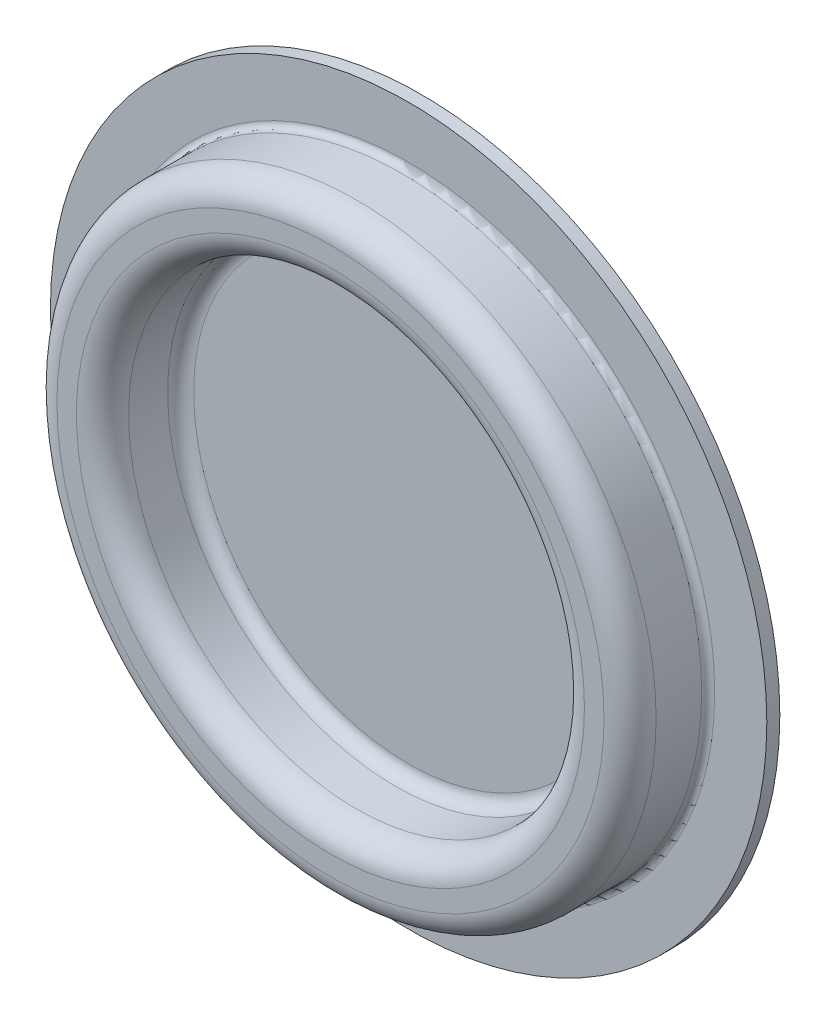
ISO-10303-21;
HEADER;
FILE_DESCRIPTION(('STEP AP214'),'2;1');
FILE_NAME('part.step','',(''),(''),'','','');
FILE_SCHEMA(('AUTOMOTIVE_DESIGN { 1 0 10303 214 1 1 1 1 }'));
ENDSEC;
DATA;
#1=APPLICATION_CONTEXT('core data for automotive mechanical design processes');
#2=APPLICATION_PROTOCOL_DEFINITION('international standard','automotive_design',2000,#1);
#3=PRODUCT_CONTEXT('',#1,'mechanical');
#4=PRODUCT('Part','Part','',(#3));
#5=PRODUCT_RELATED_PRODUCT_CATEGORY('part','',(#4));
#6=PRODUCT_DEFINITION_FORMATION('','',#4);
#7=PRODUCT_DEFINITION_CONTEXT('part definition',#1,'design');
#8=PRODUCT_DEFINITION('design','',#6,#7);
#9=PRODUCT_DEFINITION_SHAPE('','',#8);
#10=(LENGTH_UNIT() NAMED_UNIT(*) SI_UNIT(.MILLI.,.METRE.));
#11=(NAMED_UNIT(*) PLANE_ANGLE_UNIT() SI_UNIT($,.RADIAN.));
#12=(NAMED_UNIT(*) SI_UNIT($,.STERADIAN.) SOLID_ANGLE_UNIT());
#13=UNCERTAINTY_MEASURE_WITH_UNIT(LENGTH_MEASURE(1.E-05),#10,'distance_accuracy_value','');
#14=(GEOMETRIC_REPRESENTATION_CONTEXT(3) GLOBAL_UNCERTAINTY_ASSIGNED_CONTEXT((#13)) GLOBAL_UNIT_ASSIGNED_CONTEXT((#10,
#11,#12)) REPRESENTATION_CONTEXT('',''));
#15=CARTESIAN_POINT('',(0.,0.,0.));
#16=DIRECTION('',(0.,0.,1.));
#17=DIRECTION('',(1.,0.,0.));
#18=AXIS2_PLACEMENT_3D('',#15,#16,#17);
#19=CARTESIAN_POINT('',(0.,0.,74.4769920566213));
#20=DIRECTION('',(0.,0.,1.));
#21=DIRECTION('',(1.,0.,0.));
#22=AXIS2_PLACEMENT_3D('',#19,#20,#21);
#23=CYLINDRICAL_SURFACE('',#22,27.5);
#24=CARTESIAN_POINT('',(-1.11022302462516E-13,0.,0.999999999999779));
#25=DIRECTION('',(0.,0.,1.));
#26=DIRECTION('',(1.,0.,0.));
#27=AXIS2_PLACEMENT_3D('',#24,#25,#26);
#28=CIRCLE('',#27,27.5);
#29=CARTESIAN_POINT('',(27.5,0.,0.999999999999779));
#30=VERTEX_POINT('',#29);
#31=EDGE_CURVE('E12',#30,#30,#28,.T.);
#32=CARTESIAN_POINT('',(0.,0.,0.));
#33=DIRECTION('',(0.,0.,1.));
#34=DIRECTION('',(1.,0.,0.));
#35=AXIS2_PLACEMENT_3D('',#32,#33,#34);
#36=CIRCLE('',#35,27.5);
#37=CARTESIAN_POINT('',(27.5,0.,0.));
#38=VERTEX_POINT('',#37);
#39=EDGE_CURVE('E105',#38,#38,#36,.T.);
#40=CARTESIAN_POINT('',(27.5,0.,0.999999999999779));
#41=CARTESIAN_POINT('',(27.5,0.,0.989583333333113));
#42=CARTESIAN_POINT('',(27.5,0.,0.979166666666448));
#43=CARTESIAN_POINT('',(27.5,0.,0.958333333333117));
#44=CARTESIAN_POINT('',(27.5,0.,0.947916666666451));
#45=CARTESIAN_POINT('',(27.5,0.,0.927083333333125));
#46=CARTESIAN_POINT('',(27.5,0.,0.916666666666464));
#47=CARTESIAN_POINT('',(27.5,0.,0.895833333333138));
#48=CARTESIAN_POINT('',(27.5,0.,0.885416666666472));
#49=CARTESIAN_POINT('',(27.5,0.,0.864583333333141));
#50=CARTESIAN_POINT('',(27.5,0.,0.854166666666475));
#51=CARTESIAN_POINT('',(27.5,0.,0.833333333333149));
#52=CARTESIAN_POINT('',(27.5,0.,0.822916666666488));
#53=CARTESIAN_POINT('',(27.5,0.,0.802083333333162));
#54=CARTESIAN_POINT('',(27.5,0.,0.791666666666496));
#55=CARTESIAN_POINT('',(27.5,0.,0.770833333333165));
#56=CARTESIAN_POINT('',(27.5,0.,0.7604166666665));
#57=CARTESIAN_POINT('',(27.5,0.,0.739583333333169));
#58=CARTESIAN_POINT('',(27.5,0.,0.729166666666503));
#59=CARTESIAN_POINT('',(27.5,0.,0.708333333333172));
#60=CARTESIAN_POINT('',(27.5,0.,0.697916666666507));
#61=CARTESIAN_POINT('',(27.5,0.,0.67708333333318));
#62=CARTESIAN_POINT('',(27.5,0.,0.666666666666519));
#63=CARTESIAN_POINT('',(27.5,0.,0.645833333333193));
#64=CARTESIAN_POINT('',(27.5,0.,0.635416666666527));
#65=CARTESIAN_POINT('',(27.5,0.,0.614583333333196));
#66=CARTESIAN_POINT('',(27.5,0.,0.604166666666531));
#67=CARTESIAN_POINT('',(27.5,0.,0.583333333333204));
#68=CARTESIAN_POINT('',(27.5,0.,0.572916666666543));
#69=CARTESIAN_POINT('',(27.5,0.,0.552083333333217));
#70=CARTESIAN_POINT('',(27.5,0.,0.541666666666551));
#71=CARTESIAN_POINT('',(27.5,0.,0.52083333333322));
#72=CARTESIAN_POINT('',(27.5,0.,0.510416666666555));
#73=CARTESIAN_POINT('',(27.5,0.,0.489583333333224));
#74=CARTESIAN_POINT('',(27.5,0.,0.479166666666558));
#75=CARTESIAN_POINT('',(27.5,0.,0.458333333333227));
#76=CARTESIAN_POINT('',(27.5,0.,0.447916666666562));
#77=CARTESIAN_POINT('',(27.5,0.,0.427083333333235));
#78=CARTESIAN_POINT('',(27.5,0.,0.416666666666575));
#79=CARTESIAN_POINT('',(27.5,0.,0.395833333333248));
#80=CARTESIAN_POINT('',(27.5,0.,0.385416666666583));
#81=CARTESIAN_POINT('',(27.5,0.,0.364583333333252));
#82=CARTESIAN_POINT('',(27.5,0.,0.354166666666586));
#83=CARTESIAN_POINT('',(27.5,0.,0.33333333333326));
#84=CARTESIAN_POINT('',(27.5,0.,0.322916666666599));
#85=CARTESIAN_POINT('',(27.5,0.,0.302083333333272));
#86=CARTESIAN_POINT('',(27.5,0.,0.291666666666607));
#87=CARTESIAN_POINT('',(27.5,0.,0.270833333333276));
#88=CARTESIAN_POINT('',(27.5,0.,0.26041666666661));
#89=CARTESIAN_POINT('',(27.5,0.,0.239583333333279));
#90=CARTESIAN_POINT('',(27.5,0.,0.229166666666614));
#91=CARTESIAN_POINT('',(27.5,0.,0.208333333333283));
#92=CARTESIAN_POINT('',(27.5,0.,0.197916666666617));
#93=CARTESIAN_POINT('',(27.5,0.,0.177083333333291));
#94=CARTESIAN_POINT('',(27.5,0.,0.16666666666663));
#95=CARTESIAN_POINT('',(27.5,0.,0.145833333333303));
#96=CARTESIAN_POINT('',(27.5,0.,0.135416666666638));
#97=CARTESIAN_POINT('',(27.5,0.,0.114583333333307));
#98=CARTESIAN_POINT('',(27.5,0.,0.104166666666641));
#99=CARTESIAN_POINT('',(27.5,0.,0.0833333333333149));
#100=CARTESIAN_POINT('',(27.5,0.,0.072916666666654));
#101=CARTESIAN_POINT('',(27.5,0.,0.0520833333333276));
#102=CARTESIAN_POINT('',(27.5,0.,0.0416666666666621));
#103=CARTESIAN_POINT('',(27.5,0.,0.020833333333331));
#104=CARTESIAN_POINT('',(27.5,0.,0.0104166666666655));
#105=CARTESIAN_POINT('',(27.5,0.,0.));
#106=B_SPLINE_CURVE_WITH_KNOTS('',3,(#40,#41,#42,#43,#44,#45,#46,#47,#48,#49,#50,#51,#52,#53,
#54,#55,#56,#57,#58,#59,#60,#61,#62,#63,#64,#65,#66,#67,#68,#69,#70,#71,#72,#73,#74,#75,#76,#77,
#78,#79,#80,#81,#82,#83,#84,#85,#86,#87,#88,#89,#90,#91,#92,#93,#94,#95,#96,#97,#98,#99,#100,
#101,#102,#103,#104,#105),.UNSPECIFIED.,.F.,.F.,(4,2,2,2,2,2,2,2,2,2,2,2,2,2,2,2,2,2,2,2,2,2,2,
2,2,2,2,2,2,2,2,2,4),(0.,0.0312499999999966,0.0624999999999931,0.0937499999999758,
0.124999999999972,0.156249999999969,0.187499999999952,0.218749999999948,0.249999999999945,
0.281249999999941,0.312499999999938,0.343749999999921,0.374999999999917,0.406249999999914,
0.437499999999896,0.468749999999893,0.499999999999889,0.531249999999886,0.562499999999883,
0.593749999999865,0.624999999999862,0.656249999999858,0.687499999999841,0.718749999999838,
0.749999999999834,0.781249999999831,0.812499999999827,0.84374999999981,0.874999999999806,
0.906249999999803,0.937499999999786,0.968749999999782,0.999999999999779),.UNSPECIFIED.);
#107=EDGE_CURVE('BSEAM47',#30,#38,#106,.T.);
#108=ORIENTED_EDGE('',*,*,#31,.F.);
#109=ORIENTED_EDGE('',*,*,#39,.T.);
#110=ORIENTED_EDGE('',*,*,#107,.T.);
#111=ORIENTED_EDGE('',*,*,#107,.F.);
#112=EDGE_LOOP('',(#108,#110,#109,#111));
#113=FACE_BOUND('',#112,.T.);
#114=ADVANCED_FACE('F47',(#113),#23,.T.);
#115=CARTESIAN_POINT('',(1.11022302462516E-13,27.4999999999997,0.999999999999834));
#116=DIRECTION('',(0.,0.,-1.));
#117=DIRECTION('',(-1.,0.,0.));
#118=AXIS2_PLACEMENT_3D('',#115,#116,#117);
#119=PLANE('',#118);
#120=CARTESIAN_POINT('',(-1.11022302462516E-13,0.,0.999999999999779));
#121=DIRECTION('',(0.,0.,1.));
#122=DIRECTION('',(1.,0.,0.));
#123=AXIS2_PLACEMENT_3D('',#120,#121,#122);
#124=CIRCLE('',#123,23.5);
#125=CARTESIAN_POINT('',(23.4999999999999,0.,0.99999999999978));
#126=VERTEX_POINT('',#125);
#127=EDGE_CURVE('E53',#126,#126,#124,.T.);
#128=ORIENTED_EDGE('',*,*,#127,.F.);
#129=EDGE_LOOP('',(#128));
#130=FACE_BOUND('',#129,.T.);
#131=ORIENTED_EDGE('',*,*,#31,.T.);
#132=EDGE_LOOP('',(#131));
#133=FACE_BOUND('',#132,.T.);
#134=ADVANCED_FACE('F169',(#130,#133),#119,.F.);
#135=CARTESIAN_POINT('',(0.,-2.22044604925031E-13,1.49999999999978));
#136=DIRECTION('',(0.,0.,1.));
#137=DIRECTION('',(1.,0.,0.));
#138=AXIS2_PLACEMENT_3D('',#135,#136,#137);
#139=TOROIDAL_SURFACE('',#138,23.5,0.5);
#140=CARTESIAN_POINT('',(0.,-2.22044604925031E-13,1.49999999999978));
#141=DIRECTION('',(0.,0.,1.));
#142=DIRECTION('',(1.,0.,0.));
#143=AXIS2_PLACEMENT_3D('',#140,#141,#142);
#144=CIRCLE('',#143,23.);
#145=CARTESIAN_POINT('',(23.,0.,1.49999999999978));
#146=VERTEX_POINT('',#145);
#147=EDGE_CURVE('E57',#146,#146,#144,.T.);
#148=ORIENTED_EDGE('',*,*,#147,.F.);
#149=EDGE_LOOP('',(#148));
#150=FACE_BOUND('',#149,.T.);
#151=ORIENTED_EDGE('',*,*,#127,.T.);
#152=EDGE_LOOP('',(#151));
#153=FACE_BOUND('',#152,.T.);
#154=ADVANCED_FACE('F174',(#150,#153),#139,.F.);
#155=CARTESIAN_POINT('',(0.,0.,74.4769920566213));
#156=DIRECTION('',(0.,0.,1.));
#157=DIRECTION('',(1.,0.,0.));
#158=AXIS2_PLACEMENT_3D('',#155,#156,#157);
#159=CYLINDRICAL_SURFACE('',#158,23.);
#160=CARTESIAN_POINT('',(0.,0.,4.99999999999978));
#161=DIRECTION('',(0.,0.,1.));
#162=DIRECTION('',(1.,0.,0.));
#163=AXIS2_PLACEMENT_3D('',#160,#161,#162);
#164=CIRCLE('',#163,23.);
#165=CARTESIAN_POINT('',(23.,0.,4.99999999999978));
#166=VERTEX_POINT('',#165);
#167=EDGE_CURVE('E61',#166,#166,#164,.T.);
#168=CARTESIAN_POINT('',(23.,0.,4.99999999999978));
#169=CARTESIAN_POINT('',(23.,0.,4.96354166666645));
#170=CARTESIAN_POINT('',(23.,0.,4.92708333333312));
#171=CARTESIAN_POINT('',(23.,0.,4.85416666666645));
#172=CARTESIAN_POINT('',(23.,0.,4.81770833333312));
#173=CARTESIAN_POINT('',(23.,0.,4.74479166666645));
#174=CARTESIAN_POINT('',(23.,0.,4.70833333333312));
#175=CARTESIAN_POINT('',(23.,0.,4.63541666666645));
#176=CARTESIAN_POINT('',(23.,0.,4.59895833333311));
#177=CARTESIAN_POINT('',(23.,0.,4.52604166666644));
#178=CARTESIAN_POINT('',(23.,0.,4.48958333333311));
#179=CARTESIAN_POINT('',(23.,0.,4.41666666666645));
#180=CARTESIAN_POINT('',(23.,0.,4.38020833333312));
#181=CARTESIAN_POINT('',(23.,0.,4.30729166666645));
#182=CARTESIAN_POINT('',(23.,0.,4.27083333333311));
#183=CARTESIAN_POINT('',(23.,0.,4.19791666666644));
#184=CARTESIAN_POINT('',(23.,0.,4.16145833333311));
#185=CARTESIAN_POINT('',(23.,0.,4.08854166666645));
#186=CARTESIAN_POINT('',(23.,0.,4.05208333333312));
#187=CARTESIAN_POINT('',(23.,0.,3.97916666666645));
#188=CARTESIAN_POINT('',(23.,0.,3.94270833333311));
#189=CARTESIAN_POINT('',(23.,0.,3.86979166666645));
#190=CARTESIAN_POINT('',(23.,0.,3.83333333333311));
#191=CARTESIAN_POINT('',(23.,0.,3.76041666666645));
#192=CARTESIAN_POINT('',(23.,0.,3.72395833333312));
#193=CARTESIAN_POINT('',(23.,0.,3.65104166666645));
#194=CARTESIAN_POINT('',(23.,0.,3.61458333333312));
#195=CARTESIAN_POINT('',(23.,0.,3.54166666666645));
#196=CARTESIAN_POINT('',(23.,0.,3.50520833333312));
#197=CARTESIAN_POINT('',(23.,0.,3.43229166666645));
#198=CARTESIAN_POINT('',(23.,0.,3.39583333333311));
#199=CARTESIAN_POINT('',(23.,0.,3.32291666666644));
#200=CARTESIAN_POINT('',(23.,0.,3.28645833333311));
#201=CARTESIAN_POINT('',(23.,0.,3.21354166666645));
#202=CARTESIAN_POINT('',(23.,0.,3.17708333333312));
#203=CARTESIAN_POINT('',(23.,0.,3.10416666666645));
#204=CARTESIAN_POINT('',(23.,0.,3.06770833333311));
#205=CARTESIAN_POINT('',(23.,0.,2.99479166666645));
#206=CARTESIAN_POINT('',(23.,0.,2.95833333333311));
#207=CARTESIAN_POINT('',(23.,0.,2.88541666666645));
#208=CARTESIAN_POINT('',(23.,0.,2.84895833333311));
#209=CARTESIAN_POINT('',(23.,0.,2.77604166666644));
#210=CARTESIAN_POINT('',(23.,0.,2.73958333333311));
#211=CARTESIAN_POINT('',(23.,0.,2.66666666666645));
#212=CARTESIAN_POINT('',(23.,0.,2.63020833333312));
#213=CARTESIAN_POINT('',(23.,0.,2.55729166666645));
#214=CARTESIAN_POINT('',(23.,0.,2.52083333333311));
#215=CARTESIAN_POINT('',(23.,0.,2.44791666666644));
#216=CARTESIAN_POINT('',(23.,0.,2.41145833333311));
#217=CARTESIAN_POINT('',(23.,0.,2.33854166666645));
#218=CARTESIAN_POINT('',(23.,0.,2.30208333333312));
#219=CARTESIAN_POINT('',(23.,0.,2.22916666666645));
#220=CARTESIAN_POINT('',(23.,0.,2.19270833333311));
#221=CARTESIAN_POINT('',(23.,0.,2.11979166666644));
#222=CARTESIAN_POINT('',(23.,0.,2.08333333333311));
#223=CARTESIAN_POINT('',(23.,0.,2.01041666666645));
#224=CARTESIAN_POINT('',(23.,0.,1.97395833333312));
#225=CARTESIAN_POINT('',(23.,0.,1.90104166666645));
#226=CARTESIAN_POINT('',(23.,0.,1.86458333333311));
#227=CARTESIAN_POINT('',(23.,0.,1.79166666666645));
#228=CARTESIAN_POINT('',(23.,0.,1.75520833333311));
#229=CARTESIAN_POINT('',(23.,0.,1.68229166666645));
#230=CARTESIAN_POINT('',(23.,0.,1.64583333333311));
#231=CARTESIAN_POINT('',(23.,0.,1.57291666666644));
#232=CARTESIAN_POINT('',(23.,0.,1.53645833333311));
#233=CARTESIAN_POINT('',(23.,0.,1.49999999999978));
#234=B_SPLINE_CURVE_WITH_KNOTS('',3,(#168,#169,#170,#171,#172,#173,#174,#175,#176,#177,#178,
#179,#180,#181,#182,#183,#184,#185,#186,#187,#188,#189,#190,#191,#192,#193,#194,#195,#196,#197,
#198,#199,#200,#201,#202,#203,#204,#205,#206,#207,#208,#209,#210,#211,#212,#213,#214,#215,#216,
#217,#218,#219,#220,#221,#222,#223,#224,#225,#226,#227,#228,#229,#230,#231,#232,#233),
.UNSPECIFIED.,.F.,.F.,(4,2,2,2,2,2,2,2,2,2,2,2,2,2,2,2,2,2,2,2,2,2,2,2,2,2,2,2,2,2,2,2,4),(0.,
0.109374999999995,0.218750000000004,0.328124999999999,0.437500000000007,0.546875000000002,
0.656249999999997,0.765625000000006,0.875000000000001,0.984374999999996,1.09375,1.203125,
1.31249999999999,1.421875,1.53125,1.64062500000001,1.75,1.859375,1.96875000000001,2.078125,
2.18750000000001,2.296875,2.40625,2.51562500000001,2.625,2.734375,2.84375000000001,2.953125,
3.0625,3.171875,3.28125,3.39062500000001,3.5),.UNSPECIFIED.);
#235=EDGE_CURVE('BSEAM179',#166,#146,#234,.T.);
#236=ORIENTED_EDGE('',*,*,#167,.F.);
#237=ORIENTED_EDGE('',*,*,#147,.T.);
#238=ORIENTED_EDGE('',*,*,#235,.T.);
#239=ORIENTED_EDGE('',*,*,#235,.F.);
#240=EDGE_LOOP('',(#236,#238,#237,#239));
#241=FACE_BOUND('',#240,.T.);
#242=ADVANCED_FACE('F179',(#241),#159,.T.);
#243=CARTESIAN_POINT('',(0.,0.,4.99999999999978));
#244=DIRECTION('',(0.,0.,1.));
#245=DIRECTION('',(1.,0.,0.));
#246=AXIS2_PLACEMENT_3D('',#243,#244,#245);
#247=TOROIDAL_SURFACE('',#246,21.,2.);
#248=CARTESIAN_POINT('',(1.11022302462516E-13,-2.22044604925031E-13,6.99999999999984));
#249=DIRECTION('',(0.,0.,1.));
#250=DIRECTION('',(1.,0.,0.));
#251=AXIS2_PLACEMENT_3D('',#248,#249,#250);
#252=CIRCLE('',#251,21.);
#253=CARTESIAN_POINT('',(21.0000000000001,-2.22554613626969E-13,6.99999999999984));
#254=VERTEX_POINT('',#253);
#255=EDGE_CURVE('E66',#254,#254,#252,.T.);
#256=ORIENTED_EDGE('',*,*,#255,.F.);
#257=EDGE_LOOP('',(#256));
#258=FACE_BOUND('',#257,.T.);
#259=ORIENTED_EDGE('',*,*,#167,.T.);
#260=EDGE_LOOP('',(#259));
#261=FACE_BOUND('',#260,.T.);
#262=ADVANCED_FACE('F185',(#258,#261),#247,.T.);
#263=CARTESIAN_POINT('',(0.,21.0000000000001,6.99999999999984));
#264=DIRECTION('',(0.,0.,-1.));
#265=DIRECTION('',(-1.,0.,0.));
#266=AXIS2_PLACEMENT_3D('',#263,#264,#265);
#267=PLANE('',#266);
#268=CARTESIAN_POINT('',(1.11022302462516E-13,-2.22044604925031E-13,6.99999999999984));
#269=DIRECTION('',(0.,0.,1.));
#270=DIRECTION('',(1.,0.,0.));
#271=AXIS2_PLACEMENT_3D('',#268,#269,#270);
#272=CIRCLE('',#271,19.5);
#273=CARTESIAN_POINT('',(19.5000000000001,-2.22518184433973E-13,6.99999999999984));
#274=VERTEX_POINT('',#273);
#275=EDGE_CURVE('E69',#274,#274,#272,.T.);
#276=ORIENTED_EDGE('',*,*,#275,.F.);
#277=EDGE_LOOP('',(#276));
#278=FACE_BOUND('',#277,.T.);
#279=ORIENTED_EDGE('',*,*,#255,.T.);
#280=EDGE_LOOP('',(#279));
#281=FACE_BOUND('',#280,.T.);
#282=ADVANCED_FACE('F189',(#278,#281),#267,.F.);
#283=CARTESIAN_POINT('',(0.,0.,4.99999999999978));
#284=DIRECTION('',(0.,0.,1.));
#285=DIRECTION('',(1.,0.,0.));
#286=AXIS2_PLACEMENT_3D('',#283,#284,#285);
#287=TOROIDAL_SURFACE('',#286,19.5,2.);
#288=CARTESIAN_POINT('',(0.,0.,4.99999999999978));
#289=DIRECTION('',(0.,0.,1.));
#290=DIRECTION('',(1.,0.,0.));
#291=AXIS2_PLACEMENT_3D('',#288,#289,#290);
#292=CIRCLE('',#291,17.5);
#293=CARTESIAN_POINT('',(17.5,0.,4.99999999999978));
#294=VERTEX_POINT('',#293);
#295=EDGE_CURVE('E72',#294,#294,#292,.T.);
#296=ORIENTED_EDGE('',*,*,#295,.F.);
#297=EDGE_LOOP('',(#296));
#298=FACE_BOUND('',#297,.T.);
#299=ORIENTED_EDGE('',*,*,#275,.T.);
#300=EDGE_LOOP('',(#299));
#301=FACE_BOUND('',#300,.T.);
#302=ADVANCED_FACE('F193',(#298,#301),#287,.T.);
#303=CARTESIAN_POINT('',(0.,0.,74.4769920566213));
#304=DIRECTION('',(0.,0.,1.));
#305=DIRECTION('',(1.,0.,0.));
#306=AXIS2_PLACEMENT_3D('',#303,#304,#305);
#307=CYLINDRICAL_SURFACE('',#306,17.5);
#308=CARTESIAN_POINT('',(0.,0.,1.99999999999978));
#309=DIRECTION('',(0.,0.,1.));
#310=DIRECTION('',(1.,0.,0.));
#311=AXIS2_PLACEMENT_3D('',#308,#309,#310);
#312=CIRCLE('',#311,17.5);
#313=CARTESIAN_POINT('',(17.5,0.,1.99999999999978));
#314=VERTEX_POINT('',#313);
#315=EDGE_CURVE('E75',#314,#314,#312,.T.);
#316=CARTESIAN_POINT('',(17.5,0.,1.99999999999978));
#317=CARTESIAN_POINT('',(17.5,0.,2.03124999999978));
#318=CARTESIAN_POINT('',(17.5,0.,2.06249999999978));
#319=CARTESIAN_POINT('',(17.5,0.,2.12499999999978));
#320=CARTESIAN_POINT('',(17.5,0.,2.15624999999979));
#321=CARTESIAN_POINT('',(17.5,0.,2.21874999999978));
#322=CARTESIAN_POINT('',(17.5,0.,2.24999999999978));
#323=CARTESIAN_POINT('',(17.5,0.,2.31249999999978));
#324=CARTESIAN_POINT('',(17.5,0.,2.34374999999978));
#325=CARTESIAN_POINT('',(17.5,0.,2.40624999999978));
#326=CARTESIAN_POINT('',(17.5,0.,2.43749999999978));
#327=CARTESIAN_POINT('',(17.5,0.,2.49999999999978));
#328=CARTESIAN_POINT('',(17.5,0.,2.53124999999978));
#329=CARTESIAN_POINT('',(17.5,0.,2.59374999999977));
#330=CARTESIAN_POINT('',(17.5,0.,2.62499999999978));
#331=CARTESIAN_POINT('',(17.5,0.,2.68749999999978));
#332=CARTESIAN_POINT('',(17.5,0.,2.71874999999978));
#333=CARTESIAN_POINT('',(17.5,0.,2.78124999999978));
#334=CARTESIAN_POINT('',(17.5,0.,2.81249999999978));
#335=CARTESIAN_POINT('',(17.5,0.,2.87499999999979));
#336=CARTESIAN_POINT('',(17.5,0.,2.90624999999979));
#337=CARTESIAN_POINT('',(17.5,0.,2.96874999999978));
#338=CARTESIAN_POINT('',(17.5,0.,2.99999999999978));
#339=CARTESIAN_POINT('',(17.5,0.,3.06249999999978));
#340=CARTESIAN_POINT('',(17.5,0.,3.09374999999978));
#341=CARTESIAN_POINT('',(17.5,0.,3.15624999999978));
#342=CARTESIAN_POINT('',(17.5,0.,3.18749999999978));
#343=CARTESIAN_POINT('',(17.5,0.,3.24999999999978));
#344=CARTESIAN_POINT('',(17.5,0.,3.28124999999978));
#345=CARTESIAN_POINT('',(17.5,0.,3.34374999999978));
#346=CARTESIAN_POINT('',(17.5,0.,3.37499999999978));
#347=CARTESIAN_POINT('',(17.5,0.,3.43749999999978));
#348=CARTESIAN_POINT('',(17.5,0.,3.46874999999978));
#349=CARTESIAN_POINT('',(17.5,0.,3.53124999999978));
#350=CARTESIAN_POINT('',(17.5,0.,3.56249999999978));
#351=CARTESIAN_POINT('',(17.5,0.,3.62499999999979));
#352=CARTESIAN_POINT('',(17.5,0.,3.65624999999979));
#353=CARTESIAN_POINT('',(17.5,0.,3.71874999999978));
#354=CARTESIAN_POINT('',(17.5,0.,3.74999999999978));
#355=CARTESIAN_POINT('',(17.5,0.,3.81249999999978));
#356=CARTESIAN_POINT('',(17.5,0.,3.84374999999978));
#357=CARTESIAN_POINT('',(17.5,0.,3.90624999999978));
#358=CARTESIAN_POINT('',(17.5,0.,3.93749999999978));
#359=CARTESIAN_POINT('',(17.5,0.,3.99999999999978));
#360=CARTESIAN_POINT('',(17.5,0.,4.03124999999978));
#361=CARTESIAN_POINT('',(17.5,0.,4.09374999999978));
#362=CARTESIAN_POINT('',(17.5,0.,4.12499999999978));
#363=CARTESIAN_POINT('',(17.5,0.,4.18749999999978));
#364=CARTESIAN_POINT('',(17.5,0.,4.21874999999978));
#365=CARTESIAN_POINT('',(17.5,0.,4.28124999999978));
#366=CARTESIAN_POINT('',(17.5,0.,4.31249999999978));
#367=CARTESIAN_POINT('',(17.5,0.,4.37499999999979));
#368=CARTESIAN_POINT('',(17.5,0.,4.40624999999979));
#369=CARTESIAN_POINT('',(17.5,0.,4.46874999999979));
#370=CARTESIAN_POINT('',(17.5,0.,4.49999999999978));
#371=CARTESIAN_POINT('',(17.5,0.,4.56249999999978));
#372=CARTESIAN_POINT('',(17.5,0.,4.59374999999978));
#373=CARTESIAN_POINT('',(17.5,0.,4.65624999999978));
#374=CARTESIAN_POINT('',(17.5,0.,4.68749999999979));
#375=CARTESIAN_POINT('',(17.5,0.,4.74999999999978));
#376=CARTESIAN_POINT('',(17.5,0.,4.78124999999978));
#377=CARTESIAN_POINT('',(17.5,0.,4.84374999999978));
#378=CARTESIAN_POINT('',(17.5,0.,4.87499999999978));
#379=CARTESIAN_POINT('',(17.5,0.,4.93749999999978));
#380=CARTESIAN_POINT('',(17.5,0.,4.96874999999978));
#381=CARTESIAN_POINT('',(17.5,0.,4.99999999999978));
#382=B_SPLINE_CURVE_WITH_KNOTS('',3,(#316,#317,#318,#319,#320,#321,#322,#323,#324,#325,#326,
#327,#328,#329,#330,#331,#332,#333,#334,#335,#336,#337,#338,#339,#340,#341,#342,#343,#344,#345,
#346,#347,#348,#349,#350,#351,#352,#353,#354,#355,#356,#357,#358,#359,#360,#361,#362,#363,#364,
#365,#366,#367,#368,#369,#370,#371,#372,#373,#374,#375,#376,#377,#378,#379,#380,#381),
.UNSPECIFIED.,.F.,.F.,(4,2,2,2,2,2,2,2,2,2,2,2,2,2,2,2,2,2,2,2,2,2,2,2,2,2,2,2,2,2,2,2,4),(0.,
0.0937500000000036,0.187500000000007,0.281249999999997,0.375,0.468750000000004,
0.562499999999994,0.656249999999997,0.750000000000001,0.843750000000004,0.937500000000008,
1.03125,1.125,1.21875,1.31249999999999,1.40625,1.5,1.59375,1.68750000000001,1.78125,1.875,
1.96875000000001,2.06249999999999,2.15625,2.25,2.34375000000001,2.43750000000001,2.53125,2.625,
2.71875000000001,2.8125,2.90625,3.),.UNSPECIFIED.);
#383=EDGE_CURVE('BSEAM197',#314,#294,#382,.T.);
#384=ORIENTED_EDGE('',*,*,#315,.F.);
#385=ORIENTED_EDGE('',*,*,#295,.T.);
#386=ORIENTED_EDGE('',*,*,#383,.T.);
#387=ORIENTED_EDGE('',*,*,#383,.F.);
#388=EDGE_LOOP('',(#384,#386,#385,#387));
#389=FACE_BOUND('',#388,.T.);
#390=ADVANCED_FACE('F197',(#389),#307,.F.);
#391=CARTESIAN_POINT('',(0.,0.,1.99999999999978));
#392=DIRECTION('',(0.,0.,1.));
#393=DIRECTION('',(1.,0.,0.));
#394=AXIS2_PLACEMENT_3D('',#391,#392,#393);
#395=TOROIDAL_SURFACE('',#394,16.5,0.999999999999999);
#396=CARTESIAN_POINT('',(-1.11022302462516E-13,0.,0.999999999999779));
#397=DIRECTION('',(0.,0.,1.));
#398=DIRECTION('',(1.,0.,0.));
#399=AXIS2_PLACEMENT_3D('',#396,#397,#398);
#400=CIRCLE('',#399,16.5);
#401=CARTESIAN_POINT('',(16.4999999999999,0.,0.99999999999978));
#402=VERTEX_POINT('',#401);
#403=EDGE_CURVE('E78',#402,#402,#400,.T.);
#404=ORIENTED_EDGE('',*,*,#403,.F.);
#405=EDGE_LOOP('',(#404));
#406=FACE_BOUND('',#405,.T.);
#407=ORIENTED_EDGE('',*,*,#315,.T.);
#408=EDGE_LOOP('',(#407));
#409=FACE_BOUND('',#408,.T.);
#410=ADVANCED_FACE('F165',(#406,#409),#395,.F.);
#411=CARTESIAN_POINT('',(0.,1.57318602589385E-10,0.999999999997614));
#412=DIRECTION('',(0.,0.,-1.));
#413=DIRECTION('',(-1.,0.,0.));
#414=AXIS2_PLACEMENT_3D('',#411,#412,#413);
#415=PLANE('',#414);
#416=ORIENTED_EDGE('',*,*,#403,.T.);
#417=EDGE_LOOP('',(#416));
#418=FACE_BOUND('',#417,.T.);
#419=ADVANCED_FACE('F160',(#418),#415,.F.);
#420=CARTESIAN_POINT('',(1.11022302462516E-13,0.,-7.53813678144866E-09));
#421=DIRECTION('',(0.,0.,1.));
#422=DIRECTION('',(1.,0.,0.));
#423=AXIS2_PLACEMENT_3D('',#420,#421,#422);
#424=PLANE('',#423);
#425=CARTESIAN_POINT('',(0.,0.,0.));
#426=DIRECTION('',(0.,0.,1.));
#427=DIRECTION('',(1.,0.,0.));
#428=AXIS2_PLACEMENT_3D('',#425,#426,#427);
#429=CIRCLE('',#428,16.5);
#430=CARTESIAN_POINT('',(16.5,0.,0.));
#431=VERTEX_POINT('',#430);
#432=EDGE_CURVE('E81',#431,#431,#429,.T.);
#433=ORIENTED_EDGE('',*,*,#432,.F.);
#434=EDGE_LOOP('',(#433));
#435=FACE_BOUND('',#434,.T.);
#436=ADVANCED_FACE('F155',(#435),#424,.F.);
#437=CARTESIAN_POINT('',(0.,0.,1.99999999999978));
#438=DIRECTION('',(0.,0.,1.));
#439=DIRECTION('',(1.,0.,0.));
#440=AXIS2_PLACEMENT_3D('',#437,#438,#439);
#441=TOROIDAL_SURFACE('',#440,16.5,2.);
#442=CARTESIAN_POINT('',(0.,0.,1.99999999999978));
#443=DIRECTION('',(0.,0.,1.));
#444=DIRECTION('',(1.,0.,0.));
#445=AXIS2_PLACEMENT_3D('',#442,#443,#444);
#446=CIRCLE('',#445,18.5);
#447=CARTESIAN_POINT('',(18.5,0.,1.99999999999978));
#448=VERTEX_POINT('',#447);
#449=EDGE_CURVE('E84',#448,#448,#446,.T.);
#450=ORIENTED_EDGE('',*,*,#449,.F.);
#451=EDGE_LOOP('',(#450));
#452=FACE_BOUND('',#451,.T.);
#453=ORIENTED_EDGE('',*,*,#432,.T.);
#454=EDGE_LOOP('',(#453));
#455=FACE_BOUND('',#454,.T.);
#456=ADVANCED_FACE('F149',(#452,#455),#441,.T.);
#457=CARTESIAN_POINT('',(0.,0.,74.4769920566213));
#458=DIRECTION('',(0.,0.,1.));
#459=DIRECTION('',(1.,0.,0.));
#460=AXIS2_PLACEMENT_3D('',#457,#458,#459);
#461=CYLINDRICAL_SURFACE('',#460,18.5);
#462=CARTESIAN_POINT('',(0.,0.,4.99999999999978));
#463=DIRECTION('',(0.,0.,1.));
#464=DIRECTION('',(1.,0.,0.));
#465=AXIS2_PLACEMENT_3D('',#462,#463,#464);
#466=CIRCLE('',#465,18.5);
#467=CARTESIAN_POINT('',(18.5,0.,4.99999999999978));
#468=VERTEX_POINT('',#467);
#469=EDGE_CURVE('E87',#468,#468,#466,.T.);
#470=CARTESIAN_POINT('',(18.5,0.,4.99999999999978));
#471=CARTESIAN_POINT('',(18.5,0.,4.96874999999978));
#472=CARTESIAN_POINT('',(18.5,0.,4.93749999999978));
#473=CARTESIAN_POINT('',(18.5,0.,4.87499999999978));
#474=CARTESIAN_POINT('',(18.5,0.,4.84374999999978));
#475=CARTESIAN_POINT('',(18.5,0.,4.78124999999978));
#476=CARTESIAN_POINT('',(18.5,0.,4.74999999999978));
#477=CARTESIAN_POINT('',(18.5,0.,4.68749999999979));
#478=CARTESIAN_POINT('',(18.5,0.,4.65624999999978));
#479=CARTESIAN_POINT('',(18.5,0.,4.59374999999978));
#480=CARTESIAN_POINT('',(18.5,0.,4.56249999999978));
#481=CARTESIAN_POINT('',(18.5,0.,4.49999999999978));
#482=CARTESIAN_POINT('',(18.5,0.,4.46874999999979));
#483=CARTESIAN_POINT('',(18.5,0.,4.40624999999979));
#484=CARTESIAN_POINT('',(18.5,0.,4.37499999999979));
#485=CARTESIAN_POINT('',(18.5,0.,4.31249999999978));
#486=CARTESIAN_POINT('',(18.5,0.,4.28124999999978));
#487=CARTESIAN_POINT('',(18.5,0.,4.21874999999978));
#488=CARTESIAN_POINT('',(18.5,0.,4.18749999999978));
#489=CARTESIAN_POINT('',(18.5,0.,4.12499999999978));
#490=CARTESIAN_POINT('',(18.5,0.,4.09374999999978));
#491=CARTESIAN_POINT('',(18.5,0.,4.03124999999978));
#492=CARTESIAN_POINT('',(18.5,0.,3.99999999999978));
#493=CARTESIAN_POINT('',(18.5,0.,3.93749999999978));
#494=CARTESIAN_POINT('',(18.5,0.,3.90624999999978));
#495=CARTESIAN_POINT('',(18.5,0.,3.84374999999978));
#496=CARTESIAN_POINT('',(18.5,0.,3.81249999999978));
#497=CARTESIAN_POINT('',(18.5,0.,3.74999999999978));
#498=CARTESIAN_POINT('',(18.5,0.,3.71874999999978));
#499=CARTESIAN_POINT('',(18.5,0.,3.65624999999979));
#500=CARTESIAN_POINT('',(18.5,0.,3.62499999999979));
#501=CARTESIAN_POINT('',(18.5,0.,3.56249999999978));
#502=CARTESIAN_POINT('',(18.5,0.,3.53124999999978));
#503=CARTESIAN_POINT('',(18.5,0.,3.46874999999978));
#504=CARTESIAN_POINT('',(18.5,0.,3.43749999999978));
#505=CARTESIAN_POINT('',(18.5,0.,3.37499999999978));
#506=CARTESIAN_POINT('',(18.5,0.,3.34374999999978));
#507=CARTESIAN_POINT('',(18.5,0.,3.28124999999978));
#508=CARTESIAN_POINT('',(18.5,0.,3.24999999999978));
#509=CARTESIAN_POINT('',(18.5,0.,3.18749999999978));
#510=CARTESIAN_POINT('',(18.5,0.,3.15624999999978));
#511=CARTESIAN_POINT('',(18.5,0.,3.09374999999978));
#512=CARTESIAN_POINT('',(18.5,0.,3.06249999999978));
#513=CARTESIAN_POINT('',(18.5,0.,2.99999999999978));
#514=CARTESIAN_POINT('',(18.5,0.,2.96874999999978));
#515=CARTESIAN_POINT('',(18.5,0.,2.90624999999979));
#516=CARTESIAN_POINT('',(18.5,0.,2.87499999999979));
#517=CARTESIAN_POINT('',(18.5,0.,2.81249999999978));
#518=CARTESIAN_POINT('',(18.5,0.,2.78124999999978));
#519=CARTESIAN_POINT('',(18.5,0.,2.71874999999978));
#520=CARTESIAN_POINT('',(18.5,0.,2.68749999999978));
#521=CARTESIAN_POINT('',(18.5,0.,2.62499999999978));
#522=CARTESIAN_POINT('',(18.5,0.,2.59374999999977));
#523=CARTESIAN_POINT('',(18.5,0.,2.53124999999978));
#524=CARTESIAN_POINT('',(18.5,0.,2.49999999999978));
#525=CARTESIAN_POINT('',(18.5,0.,2.43749999999978));
#526=CARTESIAN_POINT('',(18.5,0.,2.40624999999978));
#527=CARTESIAN_POINT('',(18.5,0.,2.34374999999978));
#528=CARTESIAN_POINT('',(18.5,0.,2.31249999999978));
#529=CARTESIAN_POINT('',(18.5,0.,2.24999999999978));
#530=CARTESIAN_POINT('',(18.5,0.,2.21874999999978));
#531=CARTESIAN_POINT('',(18.5,0.,2.15624999999979));
#532=CARTESIAN_POINT('',(18.5,0.,2.12499999999978));
#533=CARTESIAN_POINT('',(18.5,0.,2.06249999999978));
#534=CARTESIAN_POINT('',(18.5,0.,2.03124999999978));
#535=CARTESIAN_POINT('',(18.5,0.,1.99999999999978));
#536=B_SPLINE_CURVE_WITH_KNOTS('',3,(#470,#471,#472,#473,#474,#475,#476,#477,#478,#479,#480,
#481,#482,#483,#484,#485,#486,#487,#488,#489,#490,#491,#492,#493,#494,#495,#496,#497,#498,#499,
#500,#501,#502,#503,#504,#505,#506,#507,#508,#509,#510,#511,#512,#513,#514,#515,#516,#517,#518,
#519,#520,#521,#522,#523,#524,#525,#526,#527,#528,#529,#530,#531,#532,#533,#534,#535),
.UNSPECIFIED.,.F.,.F.,(4,2,2,2,2,2,2,2,2,2,2,2,2,2,2,2,2,2,2,2,2,2,2,2,2,2,2,2,2,2,2,2,4),(0.,
0.0937500000000036,0.187500000000007,0.281249999999997,0.375,0.468750000000004,
0.562499999999994,0.656249999999997,0.750000000000001,0.843750000000004,0.937500000000008,
1.03125,1.125,1.21875,1.31249999999999,1.40625,1.5,1.59375,1.68750000000001,1.78125,1.875,
1.96875000000001,2.06249999999999,2.15625,2.25,2.34375000000001,2.43750000000001,2.53125,2.625,
2.71875000000001,2.8125,2.90625,3.),.UNSPECIFIED.);
#537=EDGE_CURVE('BSEAM143',#468,#448,#536,.T.);
#538=ORIENTED_EDGE('',*,*,#469,.F.);
#539=ORIENTED_EDGE('',*,*,#449,.T.);
#540=ORIENTED_EDGE('',*,*,#537,.T.);
#541=ORIENTED_EDGE('',*,*,#537,.F.);
#542=EDGE_LOOP('',(#538,#540,#539,#541));
#543=FACE_BOUND('',#542,.T.);
#544=ADVANCED_FACE('F143',(#543),#461,.T.);
#545=CARTESIAN_POINT('',(0.,0.,4.99999999999978));
#546=DIRECTION('',(0.,0.,1.));
#547=DIRECTION('',(1.,0.,0.));
#548=AXIS2_PLACEMENT_3D('',#545,#546,#547);
#549=TOROIDAL_SURFACE('',#548,19.5,1.);
#550=CARTESIAN_POINT('',(0.,0.,5.99999999999978));
#551=DIRECTION('',(0.,0.,1.));
#552=DIRECTION('',(1.,0.,0.));
#553=AXIS2_PLACEMENT_3D('',#550,#551,#552);
#554=CIRCLE('',#553,19.5);
#555=CARTESIAN_POINT('',(19.5,0.,5.99999999999978));
#556=VERTEX_POINT('',#555);
#557=EDGE_CURVE('E90',#556,#556,#554,.T.);
#558=ORIENTED_EDGE('',*,*,#557,.F.);
#559=EDGE_LOOP('',(#558));
#560=FACE_BOUND('',#559,.T.);
#561=ORIENTED_EDGE('',*,*,#469,.T.);
#562=EDGE_LOOP('',(#561));
#563=FACE_BOUND('',#562,.T.);
#564=ADVANCED_FACE('F137',(#560,#563),#549,.F.);
#565=CARTESIAN_POINT('',(1.11022302462516E-13,20.9999999999998,5.99999999999967));
#566=DIRECTION('',(0.,0.,1.));
#567=DIRECTION('',(1.,0.,0.));
#568=AXIS2_PLACEMENT_3D('',#565,#566,#567);
#569=PLANE('',#568);
#570=CARTESIAN_POINT('',(0.,0.,5.99999999999978));
#571=DIRECTION('',(0.,0.,1.));
#572=DIRECTION('',(1.,0.,0.));
#573=AXIS2_PLACEMENT_3D('',#570,#571,#572);
#574=CIRCLE('',#573,21.);
#575=CARTESIAN_POINT('',(21.,0.,5.99999999999978));
#576=VERTEX_POINT('',#575);
#577=EDGE_CURVE('E93',#576,#576,#574,.T.);
#578=ORIENTED_EDGE('',*,*,#577,.F.);
#579=EDGE_LOOP('',(#578));
#580=FACE_BOUND('',#579,.T.);
#581=ORIENTED_EDGE('',*,*,#557,.T.);
#582=EDGE_LOOP('',(#581));
#583=FACE_BOUND('',#582,.T.);
#584=ADVANCED_FACE('F131',(#580,#583),#569,.F.);
#585=CARTESIAN_POINT('',(0.,0.,4.99999999999978));
#586=DIRECTION('',(0.,0.,1.));
#587=DIRECTION('',(1.,0.,0.));
#588=AXIS2_PLACEMENT_3D('',#585,#586,#587);
#589=TOROIDAL_SURFACE('',#588,21.,1.);
#590=CARTESIAN_POINT('',(0.,0.,4.99999999999978));
#591=DIRECTION('',(0.,0.,1.));
#592=DIRECTION('',(1.,0.,0.));
#593=AXIS2_PLACEMENT_3D('',#590,#591,#592);
#594=CIRCLE('',#593,22.);
#595=CARTESIAN_POINT('',(22.,0.,4.99999999999978));
#596=VERTEX_POINT('',#595);
#597=EDGE_CURVE('E96',#596,#596,#594,.T.);
#598=ORIENTED_EDGE('',*,*,#597,.F.);
#599=EDGE_LOOP('',(#598));
#600=FACE_BOUND('',#599,.T.);
#601=ORIENTED_EDGE('',*,*,#577,.T.);
#602=EDGE_LOOP('',(#601));
#603=FACE_BOUND('',#602,.T.);
#604=ADVANCED_FACE('F125',(#600,#603),#589,.F.);
#605=CARTESIAN_POINT('',(0.,0.,74.4769920566213));
#606=DIRECTION('',(0.,0.,1.));
#607=DIRECTION('',(1.,0.,0.));
#608=AXIS2_PLACEMENT_3D('',#605,#606,#607);
#609=CYLINDRICAL_SURFACE('',#608,22.);
#610=CARTESIAN_POINT('',(0.,-2.22044604925031E-13,1.49999999999978));
#611=DIRECTION('',(0.,0.,1.));
#612=DIRECTION('',(1.,0.,0.));
#613=AXIS2_PLACEMENT_3D('',#610,#611,#612);
#614=CIRCLE('',#613,22.);
#615=CARTESIAN_POINT('',(22.,0.,1.49999999999978));
#616=VERTEX_POINT('',#615);
#617=EDGE_CURVE('E99',#616,#616,#614,.T.);
#618=CARTESIAN_POINT('',(22.,0.,1.49999999999978));
#619=CARTESIAN_POINT('',(22.,0.,1.53645833333311));
#620=CARTESIAN_POINT('',(22.,0.,1.57291666666644));
#621=CARTESIAN_POINT('',(22.,0.,1.64583333333311));
#622=CARTESIAN_POINT('',(22.,0.,1.68229166666645));
#623=CARTESIAN_POINT('',(22.,0.,1.75520833333311));
#624=CARTESIAN_POINT('',(22.,0.,1.79166666666645));
#625=CARTESIAN_POINT('',(22.,0.,1.86458333333311));
#626=CARTESIAN_POINT('',(22.,0.,1.90104166666645));
#627=CARTESIAN_POINT('',(22.,0.,1.97395833333312));
#628=CARTESIAN_POINT('',(22.,0.,2.01041666666645));
#629=CARTESIAN_POINT('',(22.,0.,2.08333333333311));
#630=CARTESIAN_POINT('',(22.,0.,2.11979166666644));
#631=CARTESIAN_POINT('',(22.,0.,2.19270833333311));
#632=CARTESIAN_POINT('',(22.,0.,2.22916666666645));
#633=CARTESIAN_POINT('',(22.,0.,2.30208333333312));
#634=CARTESIAN_POINT('',(22.,0.,2.33854166666645));
#635=CARTESIAN_POINT('',(22.,0.,2.41145833333311));
#636=CARTESIAN_POINT('',(22.,0.,2.44791666666644));
#637=CARTESIAN_POINT('',(22.,0.,2.52083333333311));
#638=CARTESIAN_POINT('',(22.,0.,2.55729166666645));
#639=CARTESIAN_POINT('',(22.,0.,2.63020833333312));
#640=CARTESIAN_POINT('',(22.,0.,2.66666666666645));
#641=CARTESIAN_POINT('',(22.,0.,2.73958333333311));
#642=CARTESIAN_POINT('',(22.,0.,2.77604166666644));
#643=CARTESIAN_POINT('',(22.,0.,2.84895833333311));
#644=CARTESIAN_POINT('',(22.,0.,2.88541666666645));
#645=CARTESIAN_POINT('',(22.,0.,2.95833333333311));
#646=CARTESIAN_POINT('',(22.,0.,2.99479166666645));
#647=CARTESIAN_POINT('',(22.,0.,3.06770833333311));
#648=CARTESIAN_POINT('',(22.,0.,3.10416666666645));
#649=CARTESIAN_POINT('',(22.,0.,3.17708333333312));
#650=CARTESIAN_POINT('',(22.,0.,3.21354166666645));
#651=CARTESIAN_POINT('',(22.,0.,3.28645833333311));
#652=CARTESIAN_POINT('',(22.,0.,3.32291666666644));
#653=CARTESIAN_POINT('',(22.,0.,3.39583333333311));
#654=CARTESIAN_POINT('',(22.,0.,3.43229166666645));
#655=CARTESIAN_POINT('',(22.,0.,3.50520833333312));
#656=CARTESIAN_POINT('',(22.,0.,3.54166666666645));
#657=CARTESIAN_POINT('',(22.,0.,3.61458333333312));
#658=CARTESIAN_POINT('',(22.,0.,3.65104166666645));
#659=CARTESIAN_POINT('',(22.,0.,3.72395833333312));
#660=CARTESIAN_POINT('',(22.,0.,3.76041666666645));
#661=CARTESIAN_POINT('',(22.,0.,3.83333333333311));
#662=CARTESIAN_POINT('',(22.,0.,3.86979166666645));
#663=CARTESIAN_POINT('',(22.,0.,3.94270833333311));
#664=CARTESIAN_POINT('',(22.,0.,3.97916666666645));
#665=CARTESIAN_POINT('',(22.,0.,4.05208333333312));
#666=CARTESIAN_POINT('',(22.,0.,4.08854166666645));
#667=CARTESIAN_POINT('',(22.,0.,4.16145833333311));
#668=CARTESIAN_POINT('',(22.,0.,4.19791666666644));
#669=CARTESIAN_POINT('',(22.,0.,4.27083333333311));
#670=CARTESIAN_POINT('',(22.,0.,4.30729166666645));
#671=CARTESIAN_POINT('',(22.,0.,4.38020833333312));
#672=CARTESIAN_POINT('',(22.,0.,4.41666666666645));
#673=CARTESIAN_POINT('',(22.,0.,4.48958333333311));
#674=CARTESIAN_POINT('',(22.,0.,4.52604166666644));
#675=CARTESIAN_POINT('',(22.,0.,4.59895833333311));
#676=CARTESIAN_POINT('',(22.,0.,4.63541666666645));
#677=CARTESIAN_POINT('',(22.,0.,4.70833333333312));
#678=CARTESIAN_POINT('',(22.,0.,4.74479166666645));
#679=CARTESIAN_POINT('',(22.,0.,4.81770833333312));
#680=CARTESIAN_POINT('',(22.,0.,4.85416666666645));
#681=CARTESIAN_POINT('',(22.,0.,4.92708333333312));
#682=CARTESIAN_POINT('',(22.,0.,4.96354166666645));
#683=CARTESIAN_POINT('',(22.,0.,4.99999999999978));
#684=B_SPLINE_CURVE_WITH_KNOTS('',3,(#618,#619,#620,#621,#622,#623,#624,#625,#626,#627,#628,
#629,#630,#631,#632,#633,#634,#635,#636,#637,#638,#639,#640,#641,#642,#643,#644,#645,#646,#647,
#648,#649,#650,#651,#652,#653,#654,#655,#656,#657,#658,#659,#660,#661,#662,#663,#664,#665,#666,
#667,#668,#669,#670,#671,#672,#673,#674,#675,#676,#677,#678,#679,#680,#681,#682,#683),
.UNSPECIFIED.,.F.,.F.,(4,2,2,2,2,2,2,2,2,2,2,2,2,2,2,2,2,2,2,2,2,2,2,2,2,2,2,2,2,2,2,2,4),(0.,
0.109374999999995,0.218750000000004,0.328124999999999,0.437500000000007,0.546875000000002,
0.656249999999997,0.765625000000006,0.875000000000001,0.984374999999996,1.09375,1.203125,
1.31249999999999,1.421875,1.53125,1.64062500000001,1.75,1.859375,1.96875000000001,2.078125,
2.18750000000001,2.296875,2.40625,2.51562500000001,2.625,2.734375,2.84375000000001,2.953125,
3.0625,3.171875,3.28125,3.39062500000001,3.5),.UNSPECIFIED.);
#685=EDGE_CURVE('BSEAM119',#616,#596,#684,.T.);
#686=ORIENTED_EDGE('',*,*,#617,.F.);
#687=ORIENTED_EDGE('',*,*,#597,.T.);
#688=ORIENTED_EDGE('',*,*,#685,.T.);
#689=ORIENTED_EDGE('',*,*,#685,.F.);
#690=EDGE_LOOP('',(#686,#688,#687,#689));
#691=FACE_BOUND('',#690,.T.);
#692=ADVANCED_FACE('F119',(#691),#609,.F.);
#693=CARTESIAN_POINT('',(0.,-2.22044604925031E-13,1.49999999999978));
#694=DIRECTION('',(0.,0.,1.));
#695=DIRECTION('',(1.,0.,0.));
#696=AXIS2_PLACEMENT_3D('',#693,#694,#695);
#697=TOROIDAL_SURFACE('',#696,23.5,1.5);
#698=CARTESIAN_POINT('',(0.,0.,0.));
#699=DIRECTION('',(0.,0.,1.));
#700=DIRECTION('',(1.,0.,0.));
#701=AXIS2_PLACEMENT_3D('',#698,#699,#700);
#702=CIRCLE('',#701,23.5);
#703=CARTESIAN_POINT('',(23.5,0.,0.));
#704=VERTEX_POINT('',#703);
#705=EDGE_CURVE('E102',#704,#704,#702,.T.);
#706=ORIENTED_EDGE('',*,*,#705,.F.);
#707=EDGE_LOOP('',(#706));
#708=FACE_BOUND('',#707,.T.);
#709=ORIENTED_EDGE('',*,*,#617,.T.);
#710=EDGE_LOOP('',(#709));
#711=FACE_BOUND('',#710,.T.);
#712=ADVANCED_FACE('F113',(#708,#711),#697,.T.);
#713=CARTESIAN_POINT('',(1.11022302462516E-13,27.5000000000001,0.));
#714=DIRECTION('',(0.,0.,1.));
#715=DIRECTION('',(1.,0.,0.));
#716=AXIS2_PLACEMENT_3D('',#713,#714,#715);
#717=PLANE('',#716);
#718=ORIENTED_EDGE('',*,*,#39,.F.);
#719=EDGE_LOOP('',(#718));
#720=FACE_BOUND('',#719,.T.);
#721=ORIENTED_EDGE('',*,*,#705,.T.);
#722=EDGE_LOOP('',(#721));
#723=FACE_BOUND('',#722,.T.);
#724=ADVANCED_FACE('F110',(#720,#723),#717,.F.);
#725=CLOSED_SHELL('',(#114,#134,#154,#242,#262,#282,#302,#390,#410,#419,#436,#456,#544,#564,
#584,#604,#692,#712,#724));
#726=MANIFOLD_SOLID_BREP('B2',#725);
#727=ADVANCED_BREP_SHAPE_REPRESENTATION('',(#18,#726),#14);
#728=SHAPE_DEFINITION_REPRESENTATION(#9,#727);
ENDSEC;
END-ISO-10303-21;
